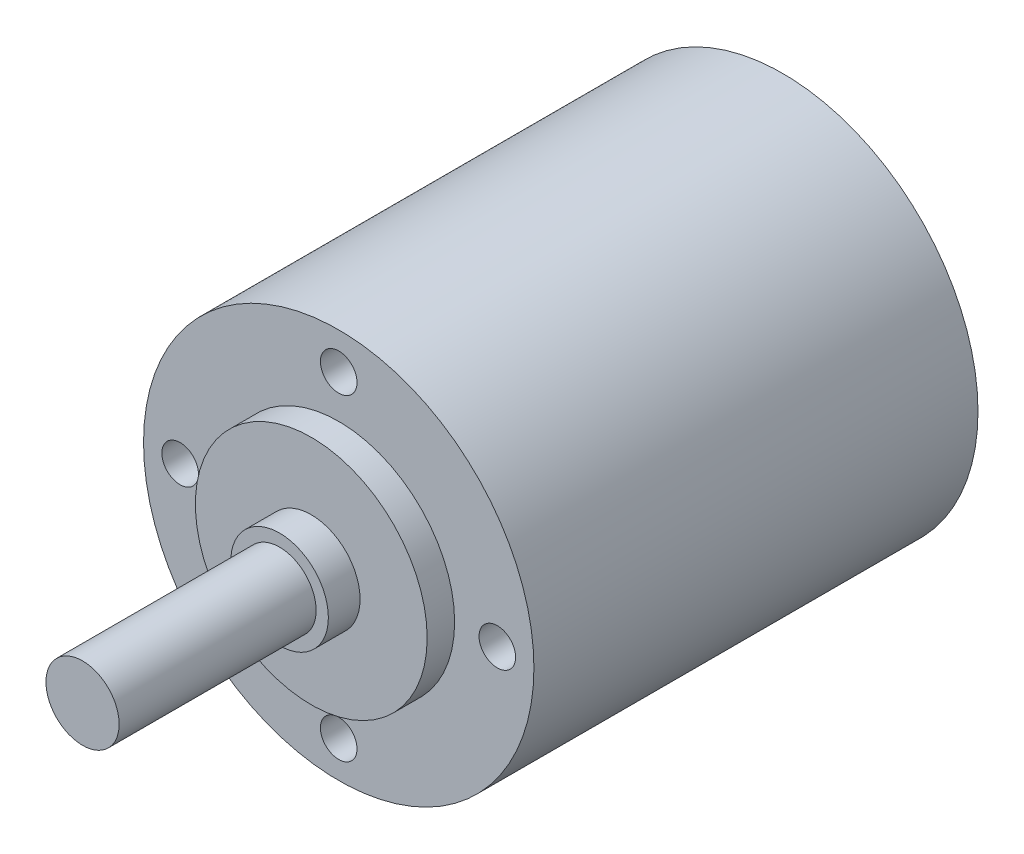
ISO-10303-21;
HEADER;
FILE_DESCRIPTION(('STEP AP214'),'2;1');
FILE_NAME('part.step','',(''),(''),'','','');
FILE_SCHEMA(('AUTOMOTIVE_DESIGN { 1 0 10303 214 1 1 1 1 }'));
ENDSEC;
DATA;
#1=APPLICATION_CONTEXT('core data for automotive mechanical design processes');
#2=APPLICATION_PROTOCOL_DEFINITION('international standard','automotive_design',2000,#1);
#3=PRODUCT_CONTEXT('',#1,'mechanical');
#4=PRODUCT('Part','Part','',(#3));
#5=PRODUCT_RELATED_PRODUCT_CATEGORY('part','',(#4));
#6=PRODUCT_DEFINITION_FORMATION('','',#4);
#7=PRODUCT_DEFINITION_CONTEXT('part definition',#1,'design');
#8=PRODUCT_DEFINITION('design','',#6,#7);
#9=PRODUCT_DEFINITION_SHAPE('','',#8);
#10=(LENGTH_UNIT() NAMED_UNIT(*) SI_UNIT(.MILLI.,.METRE.));
#11=(NAMED_UNIT(*) PLANE_ANGLE_UNIT() SI_UNIT($,.RADIAN.));
#12=(NAMED_UNIT(*) SI_UNIT($,.STERADIAN.) SOLID_ANGLE_UNIT());
#13=UNCERTAINTY_MEASURE_WITH_UNIT(LENGTH_MEASURE(1.E-05),#10,'distance_accuracy_value','');
#14=(GEOMETRIC_REPRESENTATION_CONTEXT(3) GLOBAL_UNCERTAINTY_ASSIGNED_CONTEXT((#13)) GLOBAL_UNIT_ASSIGNED_CONTEXT((#10,
#11,#12)) REPRESENTATION_CONTEXT('',''));
#15=CARTESIAN_POINT('',(0.,0.,0.));
#16=DIRECTION('',(0.,0.,1.));
#17=DIRECTION('',(1.,0.,0.));
#18=AXIS2_PLACEMENT_3D('',#15,#16,#17);
#19=CARTESIAN_POINT('',(0.,0.,41.25));
#20=DIRECTION('',(0.,0.,1.));
#21=DIRECTION('',(1.,0.,0.));
#22=AXIS2_PLACEMENT_3D('',#19,#20,#21);
#23=PLANE('',#22);
#24=CARTESIAN_POINT('',(0.,0.,41.25));
#25=DIRECTION('',(0.,0.,1.));
#26=DIRECTION('',(1.,0.,0.));
#27=AXIS2_PLACEMENT_3D('',#24,#25,#26);
#28=CIRCLE('',#27,4.);
#29=CARTESIAN_POINT('',(4.,0.,41.25));
#30=VERTEX_POINT('',#29);
#31=EDGE_CURVE('E45',#30,#30,#28,.T.);
#32=ORIENTED_EDGE('',*,*,#31,.T.);
#33=EDGE_LOOP('',(#32));
#34=FACE_BOUND('',#33,.T.);
#35=CARTESIAN_POINT('',(0.,0.,41.25));
#36=DIRECTION('',(0.,0.,1.));
#37=DIRECTION('',(1.,0.,0.));
#38=AXIS2_PLACEMENT_3D('',#35,#36,#37);
#39=CIRCLE('',#38,3.);
#40=CARTESIAN_POINT('',(3.,0.,41.25));
#41=VERTEX_POINT('',#40);
#42=EDGE_CURVE('E54',#41,#41,#39,.T.);
#43=ORIENTED_EDGE('',*,*,#42,.F.);
#44=EDGE_LOOP('',(#43));
#45=FACE_BOUND('',#44,.T.);
#46=ADVANCED_FACE('F29',(#34,#45),#23,.T.);
#47=CARTESIAN_POINT('',(0.,0.,38.65));
#48=DIRECTION('',(0.,0.,1.));
#49=DIRECTION('',(1.,0.,0.));
#50=AXIS2_PLACEMENT_3D('',#47,#48,#49);
#51=PLANE('',#50);
#52=CARTESIAN_POINT('',(0.,0.,38.65));
#53=DIRECTION('',(0.,0.,1.));
#54=DIRECTION('',(1.,0.,0.));
#55=AXIS2_PLACEMENT_3D('',#52,#53,#54);
#56=CIRCLE('',#55,9.5);
#57=CARTESIAN_POINT('',(9.5,0.,38.65));
#58=VERTEX_POINT('',#57);
#59=EDGE_CURVE('E40',#58,#58,#56,.T.);
#60=ORIENTED_EDGE('',*,*,#59,.T.);
#61=EDGE_LOOP('',(#60));
#62=FACE_BOUND('',#61,.T.);
#63=CARTESIAN_POINT('',(0.,0.,38.65));
#64=DIRECTION('',(0.,0.,1.));
#65=DIRECTION('',(1.,0.,0.));
#66=AXIS2_PLACEMENT_3D('',#63,#64,#65);
#67=CIRCLE('',#66,4.);
#68=CARTESIAN_POINT('',(4.,0.,38.65));
#69=VERTEX_POINT('',#68);
#70=EDGE_CURVE('E48',#69,#69,#67,.T.);
#71=ORIENTED_EDGE('',*,*,#70,.F.);
#72=EDGE_LOOP('',(#71));
#73=FACE_BOUND('',#72,.T.);
#74=ADVANCED_FACE('F96',(#62,#73),#51,.T.);
#75=CARTESIAN_POINT('',(0.,0.,36.4));
#76=DIRECTION('',(0.,0.,1.));
#77=DIRECTION('',(1.,0.,0.));
#78=AXIS2_PLACEMENT_3D('',#75,#76,#77);
#79=PLANE('',#78);
#80=CARTESIAN_POINT('',(-12.9999999999998,-1.81557029619843E-13,36.4));
#81=DIRECTION('',(0.,0.,1.));
#82=DIRECTION('',(1.,0.,0.));
#83=AXIS2_PLACEMENT_3D('',#80,#81,#82);
#84=CIRCLE('',#83,1.50000000000036);
#85=CARTESIAN_POINT('',(-11.4999999999995,-1.81557029619843E-13,36.4));
#86=VERTEX_POINT('',#85);
#87=EDGE_CURVE('E78',#86,#86,#84,.T.);
#88=ORIENTED_EDGE('',*,*,#87,.F.);
#89=EDGE_LOOP('',(#88));
#90=FACE_BOUND('',#89,.T.);
#91=CARTESIAN_POINT('',(3.66298140917469E-13,-13.,36.4));
#92=DIRECTION('',(0.,0.,1.));
#93=DIRECTION('',(1.,0.,0.));
#94=AXIS2_PLACEMENT_3D('',#91,#92,#93);
#95=CIRCLE('',#94,1.50000000000044);
#96=CARTESIAN_POINT('',(1.5000000000008,-13.,36.4));
#97=VERTEX_POINT('',#96);
#98=EDGE_CURVE('E72',#97,#97,#95,.T.);
#99=ORIENTED_EDGE('',*,*,#98,.F.);
#100=EDGE_LOOP('',(#99));
#101=FACE_BOUND('',#100,.T.);
#102=CARTESIAN_POINT('',(13.,0.,36.4));
#103=DIRECTION('',(0.,0.,1.));
#104=DIRECTION('',(1.,0.,0.));
#105=AXIS2_PLACEMENT_3D('',#102,#103,#104);
#106=CIRCLE('',#105,1.5);
#107=CARTESIAN_POINT('',(14.5,0.,36.4));
#108=VERTEX_POINT('',#107);
#109=EDGE_CURVE('E66',#108,#108,#106,.T.);
#110=ORIENTED_EDGE('',*,*,#109,.F.);
#111=EDGE_LOOP('',(#110));
#112=FACE_BOUND('',#111,.T.);
#113=CARTESIAN_POINT('',(0.,13.,36.4));
#114=DIRECTION('',(0.,0.,1.));
#115=DIRECTION('',(1.,0.,0.));
#116=AXIS2_PLACEMENT_3D('',#113,#114,#115);
#117=CIRCLE('',#116,1.5);
#118=CARTESIAN_POINT('',(1.5,13.,36.4));
#119=VERTEX_POINT('',#118);
#120=EDGE_CURVE('E60',#119,#119,#117,.T.);
#121=ORIENTED_EDGE('',*,*,#120,.F.);
#122=EDGE_LOOP('',(#121));
#123=FACE_BOUND('',#122,.T.);
#124=CARTESIAN_POINT('',(0.,0.,36.4));
#125=DIRECTION('',(0.,0.,1.));
#126=DIRECTION('',(1.,0.,0.));
#127=AXIS2_PLACEMENT_3D('',#124,#125,#126);
#128=CIRCLE('',#127,16.);
#129=CARTESIAN_POINT('',(16.,0.,36.4));
#130=VERTEX_POINT('',#129);
#131=EDGE_CURVE('E10',#130,#130,#128,.T.);
#132=ORIENTED_EDGE('',*,*,#131,.T.);
#133=EDGE_LOOP('',(#132));
#134=FACE_BOUND('',#133,.T.);
#135=CARTESIAN_POINT('',(0.,0.,36.4));
#136=DIRECTION('',(0.,0.,1.));
#137=DIRECTION('',(1.,0.,0.));
#138=AXIS2_PLACEMENT_3D('',#135,#136,#137);
#139=CIRCLE('',#138,9.5);
#140=CARTESIAN_POINT('',(9.5,0.,36.4));
#141=VERTEX_POINT('',#140);
#142=EDGE_CURVE('E42',#141,#141,#139,.T.);
#143=ORIENTED_EDGE('',*,*,#142,.F.);
#144=EDGE_LOOP('',(#143));
#145=FACE_BOUND('',#144,.T.);
#146=ADVANCED_FACE('F93',(#90,#101,#112,#123,#134,#145),#79,.T.);
#147=CARTESIAN_POINT('',(0.,0.,36.4));
#148=DIRECTION('',(0.,0.,-1.));
#149=DIRECTION('',(-1.,0.,0.));
#150=AXIS2_PLACEMENT_3D('',#147,#148,#149);
#151=CYLINDRICAL_SURFACE('',#150,16.);
#152=ORIENTED_EDGE('',*,*,#131,.F.);
#153=EDGE_LOOP('',(#152));
#154=FACE_BOUND('',#153,.T.);
#155=CARTESIAN_POINT('',(0.,0.,0.));
#156=DIRECTION('',(0.,0.,1.));
#157=DIRECTION('',(1.,0.,0.));
#158=AXIS2_PLACEMENT_3D('',#155,#156,#157);
#159=CIRCLE('',#158,16.);
#160=CARTESIAN_POINT('',(16.,0.,0.));
#161=VERTEX_POINT('',#160);
#162=EDGE_CURVE('E33',#161,#161,#159,.T.);
#163=ORIENTED_EDGE('',*,*,#162,.T.);
#164=EDGE_LOOP('',(#163));
#165=FACE_BOUND('',#164,.T.);
#166=ADVANCED_FACE('F31',(#154,#165),#151,.T.);
#167=CARTESIAN_POINT('',(0.,0.,0.));
#168=DIRECTION('',(0.,0.,1.));
#169=DIRECTION('',(1.,0.,0.));
#170=AXIS2_PLACEMENT_3D('',#167,#168,#169);
#171=PLANE('',#170);
#172=ORIENTED_EDGE('',*,*,#162,.F.);
#173=EDGE_LOOP('',(#172));
#174=FACE_BOUND('',#173,.T.);
#175=ADVANCED_FACE('F109',(#174),#171,.F.);
#176=CARTESIAN_POINT('',(0.,0.,38.65));
#177=DIRECTION('',(0.,0.,-1.));
#178=DIRECTION('',(-1.,0.,0.));
#179=AXIS2_PLACEMENT_3D('',#176,#177,#178);
#180=CYLINDRICAL_SURFACE('',#179,9.5);
#181=ORIENTED_EDGE('',*,*,#59,.F.);
#182=EDGE_LOOP('',(#181));
#183=FACE_BOUND('',#182,.T.);
#184=ORIENTED_EDGE('',*,*,#142,.T.);
#185=EDGE_LOOP('',(#184));
#186=FACE_BOUND('',#185,.T.);
#187=ADVANCED_FACE('F106',(#183,#186),#180,.T.);
#188=CARTESIAN_POINT('',(0.,0.,41.25));
#189=DIRECTION('',(0.,0.,-1.));
#190=DIRECTION('',(-1.,0.,0.));
#191=AXIS2_PLACEMENT_3D('',#188,#189,#190);
#192=CYLINDRICAL_SURFACE('',#191,4.);
#193=ORIENTED_EDGE('',*,*,#31,.F.);
#194=EDGE_LOOP('',(#193));
#195=FACE_BOUND('',#194,.T.);
#196=ORIENTED_EDGE('',*,*,#70,.T.);
#197=EDGE_LOOP('',(#196));
#198=FACE_BOUND('',#197,.T.);
#199=ADVANCED_FACE('F108',(#195,#198),#192,.T.);
#200=CARTESIAN_POINT('',(0.,0.,57.4));
#201=DIRECTION('',(0.,0.,-1.));
#202=DIRECTION('',(-1.,0.,0.));
#203=AXIS2_PLACEMENT_3D('',#200,#201,#202);
#204=CYLINDRICAL_SURFACE('',#203,3.);
#205=CARTESIAN_POINT('',(0.,0.,57.4));
#206=DIRECTION('',(0.,0.,1.));
#207=DIRECTION('',(1.,0.,0.));
#208=AXIS2_PLACEMENT_3D('',#205,#206,#207);
#209=CIRCLE('',#208,3.);
#210=CARTESIAN_POINT('',(3.,0.,57.4));
#211=VERTEX_POINT('',#210);
#212=EDGE_CURVE('E51',#211,#211,#209,.T.);
#213=ORIENTED_EDGE('',*,*,#212,.F.);
#214=EDGE_LOOP('',(#213));
#215=FACE_BOUND('',#214,.T.);
#216=ORIENTED_EDGE('',*,*,#42,.T.);
#217=EDGE_LOOP('',(#216));
#218=FACE_BOUND('',#217,.T.);
#219=ADVANCED_FACE('F116',(#215,#218),#204,.T.);
#220=CARTESIAN_POINT('',(0.,0.,57.4));
#221=DIRECTION('',(0.,0.,1.));
#222=DIRECTION('',(1.,0.,0.));
#223=AXIS2_PLACEMENT_3D('',#220,#221,#222);
#224=PLANE('',#223);
#225=ORIENTED_EDGE('',*,*,#212,.T.);
#226=EDGE_LOOP('',(#225));
#227=FACE_BOUND('',#226,.T.);
#228=ADVANCED_FACE('F133',(#227),#224,.T.);
#229=CARTESIAN_POINT('',(0.,13.,32.6));
#230=DIRECTION('',(0.,0.,1.));
#231=DIRECTION('',(1.,0.,0.));
#232=AXIS2_PLACEMENT_3D('',#229,#230,#231);
#233=CYLINDRICAL_SURFACE('',#232,1.5);
#234=CARTESIAN_POINT('',(0.,13.,32.6));
#235=DIRECTION('',(0.,0.,1.));
#236=DIRECTION('',(1.,0.,0.));
#237=AXIS2_PLACEMENT_3D('',#234,#235,#236);
#238=CIRCLE('',#237,1.5);
#239=CARTESIAN_POINT('',(1.5,13.,32.6));
#240=VERTEX_POINT('',#239);
#241=EDGE_CURVE('E57',#240,#240,#238,.T.);
#242=CARTESIAN_POINT('',(1.5,13.,32.6));
#243=CARTESIAN_POINT('',(1.5,13.,32.6395833333333));
#244=CARTESIAN_POINT('',(1.5,13.,32.6791666666667));
#245=CARTESIAN_POINT('',(1.5,13.,32.7583333333333));
#246=CARTESIAN_POINT('',(1.5,13.,32.7979166666667));
#247=CARTESIAN_POINT('',(1.5,13.,32.8770833333333));
#248=CARTESIAN_POINT('',(1.5,13.,32.9166666666667));
#249=CARTESIAN_POINT('',(1.5,13.,32.9958333333333));
#250=CARTESIAN_POINT('',(1.5,13.,33.0354166666667));
#251=CARTESIAN_POINT('',(1.5,13.,33.1145833333333));
#252=CARTESIAN_POINT('',(1.5,13.,33.1541666666667));
#253=CARTESIAN_POINT('',(1.5,13.,33.2333333333333));
#254=CARTESIAN_POINT('',(1.5,13.,33.2729166666667));
#255=CARTESIAN_POINT('',(1.5,13.,33.3520833333333));
#256=CARTESIAN_POINT('',(1.5,13.,33.3916666666667));
#257=CARTESIAN_POINT('',(1.5,13.,33.4708333333333));
#258=CARTESIAN_POINT('',(1.5,13.,33.5104166666667));
#259=CARTESIAN_POINT('',(1.5,13.,33.5895833333333));
#260=CARTESIAN_POINT('',(1.5,13.,33.6291666666667));
#261=CARTESIAN_POINT('',(1.5,13.,33.7083333333333));
#262=CARTESIAN_POINT('',(1.5,13.,33.7479166666667));
#263=CARTESIAN_POINT('',(1.5,13.,33.8270833333333));
#264=CARTESIAN_POINT('',(1.5,13.,33.8666666666667));
#265=CARTESIAN_POINT('',(1.5,13.,33.9458333333333));
#266=CARTESIAN_POINT('',(1.5,13.,33.9854166666667));
#267=CARTESIAN_POINT('',(1.5,13.,34.0645833333333));
#268=CARTESIAN_POINT('',(1.5,13.,34.1041666666667));
#269=CARTESIAN_POINT('',(1.5,13.,34.1833333333333));
#270=CARTESIAN_POINT('',(1.5,13.,34.2229166666667));
#271=CARTESIAN_POINT('',(1.5,13.,34.3020833333333));
#272=CARTESIAN_POINT('',(1.5,13.,34.3416666666667));
#273=CARTESIAN_POINT('',(1.5,13.,34.4208333333333));
#274=CARTESIAN_POINT('',(1.5,13.,34.4604166666667));
#275=CARTESIAN_POINT('',(1.5,13.,34.5395833333333));
#276=CARTESIAN_POINT('',(1.5,13.,34.5791666666667));
#277=CARTESIAN_POINT('',(1.5,13.,34.6583333333333));
#278=CARTESIAN_POINT('',(1.5,13.,34.6979166666667));
#279=CARTESIAN_POINT('',(1.5,13.,34.7770833333333));
#280=CARTESIAN_POINT('',(1.5,13.,34.8166666666667));
#281=CARTESIAN_POINT('',(1.5,13.,34.8958333333333));
#282=CARTESIAN_POINT('',(1.5,13.,34.9354166666667));
#283=CARTESIAN_POINT('',(1.5,13.,35.0145833333333));
#284=CARTESIAN_POINT('',(1.5,13.,35.0541666666667));
#285=CARTESIAN_POINT('',(1.5,13.,35.1333333333333));
#286=CARTESIAN_POINT('',(1.5,13.,35.1729166666667));
#287=CARTESIAN_POINT('',(1.5,13.,35.2520833333333));
#288=CARTESIAN_POINT('',(1.5,13.,35.2916666666667));
#289=CARTESIAN_POINT('',(1.5,13.,35.3708333333333));
#290=CARTESIAN_POINT('',(1.5,13.,35.4104166666667));
#291=CARTESIAN_POINT('',(1.5,13.,35.4895833333333));
#292=CARTESIAN_POINT('',(1.5,13.,35.5291666666667));
#293=CARTESIAN_POINT('',(1.5,13.,35.6083333333333));
#294=CARTESIAN_POINT('',(1.5,13.,35.6479166666667));
#295=CARTESIAN_POINT('',(1.5,13.,35.7270833333333));
#296=CARTESIAN_POINT('',(1.5,13.,35.7666666666667));
#297=CARTESIAN_POINT('',(1.5,13.,35.8458333333333));
#298=CARTESIAN_POINT('',(1.5,13.,35.8854166666667));
#299=CARTESIAN_POINT('',(1.5,13.,35.9645833333333));
#300=CARTESIAN_POINT('',(1.5,13.,36.0041666666667));
#301=CARTESIAN_POINT('',(1.5,13.,36.0833333333333));
#302=CARTESIAN_POINT('',(1.5,13.,36.1229166666667));
#303=CARTESIAN_POINT('',(1.5,13.,36.2020833333333));
#304=CARTESIAN_POINT('',(1.5,13.,36.2416666666667));
#305=CARTESIAN_POINT('',(1.5,13.,36.3208333333333));
#306=CARTESIAN_POINT('',(1.5,13.,36.3604166666667));
#307=CARTESIAN_POINT('',(1.5,13.,36.4));
#308=B_SPLINE_CURVE_WITH_KNOTS('',3,(#242,#243,#244,#245,#246,#247,#248,#249,#250,#251,#252,
#253,#254,#255,#256,#257,#258,#259,#260,#261,#262,#263,#264,#265,#266,#267,#268,#269,#270,#271,
#272,#273,#274,#275,#276,#277,#278,#279,#280,#281,#282,#283,#284,#285,#286,#287,#288,#289,#290,
#291,#292,#293,#294,#295,#296,#297,#298,#299,#300,#301,#302,#303,#304,#305,#306,#307),
.UNSPECIFIED.,.F.,.F.,(4,2,2,2,2,2,2,2,2,2,2,2,2,2,2,2,2,2,2,2,2,2,2,2,2,2,2,2,2,2,2,2,4),(0.,
0.118750000000001,0.237500000000002,0.356250000000002,0.475000000000003,0.593750000000004,
0.712500000000005,0.831250000000006,0.95,1.06875,1.1875,1.30625,1.425,1.54375,1.6625,
1.78125000000001,1.9,2.01875,2.1375,2.25625,2.375,2.49375,2.6125,2.73125,2.85,2.96875,3.0875,
3.20625,3.325,3.44375,3.5625,3.68125,3.8),.UNSPECIFIED.);
#309=EDGE_CURVE('BSEAM137',#240,#119,#308,.T.);
#310=ORIENTED_EDGE('',*,*,#241,.F.);
#311=ORIENTED_EDGE('',*,*,#120,.T.);
#312=ORIENTED_EDGE('',*,*,#309,.T.);
#313=ORIENTED_EDGE('',*,*,#309,.F.);
#314=EDGE_LOOP('',(#310,#312,#311,#313));
#315=FACE_BOUND('',#314,.T.);
#316=ADVANCED_FACE('F137',(#315),#233,.F.);
#317=CARTESIAN_POINT('',(0.,13.,32.6));
#318=DIRECTION('',(0.,0.,1.));
#319=DIRECTION('',(1.,0.,0.));
#320=AXIS2_PLACEMENT_3D('',#317,#318,#319);
#321=PLANE('',#320);
#322=ORIENTED_EDGE('',*,*,#241,.T.);
#323=EDGE_LOOP('',(#322));
#324=FACE_BOUND('',#323,.T.);
#325=ADVANCED_FACE('F141',(#324),#321,.T.);
#326=CARTESIAN_POINT('',(13.,0.,32.6));
#327=DIRECTION('',(0.,0.,1.));
#328=DIRECTION('',(1.,0.,0.));
#329=AXIS2_PLACEMENT_3D('',#326,#327,#328);
#330=CYLINDRICAL_SURFACE('',#329,1.5);
#331=CARTESIAN_POINT('',(13.,0.,32.6));
#332=DIRECTION('',(0.,0.,1.));
#333=DIRECTION('',(1.,0.,0.));
#334=AXIS2_PLACEMENT_3D('',#331,#332,#333);
#335=CIRCLE('',#334,1.5);
#336=CARTESIAN_POINT('',(14.5,0.,32.6));
#337=VERTEX_POINT('',#336);
#338=EDGE_CURVE('E63',#337,#337,#335,.T.);
#339=CARTESIAN_POINT('',(14.5,0.,32.6));
#340=CARTESIAN_POINT('',(14.5,0.,32.6395833333333));
#341=CARTESIAN_POINT('',(14.5,0.,32.6791666666667));
#342=CARTESIAN_POINT('',(14.5,0.,32.7583333333333));
#343=CARTESIAN_POINT('',(14.5,0.,32.7979166666667));
#344=CARTESIAN_POINT('',(14.5,0.,32.8770833333333));
#345=CARTESIAN_POINT('',(14.5,0.,32.9166666666667));
#346=CARTESIAN_POINT('',(14.5,0.,32.9958333333333));
#347=CARTESIAN_POINT('',(14.5,0.,33.0354166666667));
#348=CARTESIAN_POINT('',(14.5,0.,33.1145833333333));
#349=CARTESIAN_POINT('',(14.5,0.,33.1541666666667));
#350=CARTESIAN_POINT('',(14.5,0.,33.2333333333333));
#351=CARTESIAN_POINT('',(14.5,0.,33.2729166666667));
#352=CARTESIAN_POINT('',(14.5,0.,33.3520833333333));
#353=CARTESIAN_POINT('',(14.5,0.,33.3916666666667));
#354=CARTESIAN_POINT('',(14.5,0.,33.4708333333333));
#355=CARTESIAN_POINT('',(14.5,0.,33.5104166666667));
#356=CARTESIAN_POINT('',(14.5,0.,33.5895833333333));
#357=CARTESIAN_POINT('',(14.5,0.,33.6291666666667));
#358=CARTESIAN_POINT('',(14.5,0.,33.7083333333333));
#359=CARTESIAN_POINT('',(14.5,0.,33.7479166666667));
#360=CARTESIAN_POINT('',(14.5,0.,33.8270833333333));
#361=CARTESIAN_POINT('',(14.5,0.,33.8666666666667));
#362=CARTESIAN_POINT('',(14.5,0.,33.9458333333333));
#363=CARTESIAN_POINT('',(14.5,0.,33.9854166666667));
#364=CARTESIAN_POINT('',(14.5,0.,34.0645833333333));
#365=CARTESIAN_POINT('',(14.5,0.,34.1041666666667));
#366=CARTESIAN_POINT('',(14.5,0.,34.1833333333333));
#367=CARTESIAN_POINT('',(14.5,0.,34.2229166666667));
#368=CARTESIAN_POINT('',(14.5,0.,34.3020833333333));
#369=CARTESIAN_POINT('',(14.5,0.,34.3416666666667));
#370=CARTESIAN_POINT('',(14.5,0.,34.4208333333333));
#371=CARTESIAN_POINT('',(14.5,0.,34.4604166666667));
#372=CARTESIAN_POINT('',(14.5,0.,34.5395833333333));
#373=CARTESIAN_POINT('',(14.5,0.,34.5791666666667));
#374=CARTESIAN_POINT('',(14.5,0.,34.6583333333333));
#375=CARTESIAN_POINT('',(14.5,0.,34.6979166666667));
#376=CARTESIAN_POINT('',(14.5,0.,34.7770833333333));
#377=CARTESIAN_POINT('',(14.5,0.,34.8166666666667));
#378=CARTESIAN_POINT('',(14.5,0.,34.8958333333333));
#379=CARTESIAN_POINT('',(14.5,0.,34.9354166666667));
#380=CARTESIAN_POINT('',(14.5,0.,35.0145833333333));
#381=CARTESIAN_POINT('',(14.5,0.,35.0541666666667));
#382=CARTESIAN_POINT('',(14.5,0.,35.1333333333333));
#383=CARTESIAN_POINT('',(14.5,0.,35.1729166666667));
#384=CARTESIAN_POINT('',(14.5,0.,35.2520833333333));
#385=CARTESIAN_POINT('',(14.5,0.,35.2916666666667));
#386=CARTESIAN_POINT('',(14.5,0.,35.3708333333333));
#387=CARTESIAN_POINT('',(14.5,0.,35.4104166666667));
#388=CARTESIAN_POINT('',(14.5,0.,35.4895833333333));
#389=CARTESIAN_POINT('',(14.5,0.,35.5291666666667));
#390=CARTESIAN_POINT('',(14.5,0.,35.6083333333333));
#391=CARTESIAN_POINT('',(14.5,0.,35.6479166666667));
#392=CARTESIAN_POINT('',(14.5,0.,35.7270833333333));
#393=CARTESIAN_POINT('',(14.5,0.,35.7666666666667));
#394=CARTESIAN_POINT('',(14.5,0.,35.8458333333333));
#395=CARTESIAN_POINT('',(14.5,0.,35.8854166666667));
#396=CARTESIAN_POINT('',(14.5,0.,35.9645833333333));
#397=CARTESIAN_POINT('',(14.5,0.,36.0041666666667));
#398=CARTESIAN_POINT('',(14.5,0.,36.0833333333333));
#399=CARTESIAN_POINT('',(14.5,0.,36.1229166666667));
#400=CARTESIAN_POINT('',(14.5,0.,36.2020833333333));
#401=CARTESIAN_POINT('',(14.5,0.,36.2416666666667));
#402=CARTESIAN_POINT('',(14.5,0.,36.3208333333333));
#403=CARTESIAN_POINT('',(14.5,0.,36.3604166666667));
#404=CARTESIAN_POINT('',(14.5,0.,36.4));
#405=B_SPLINE_CURVE_WITH_KNOTS('',3,(#339,#340,#341,#342,#343,#344,#345,#346,#347,#348,#349,
#350,#351,#352,#353,#354,#355,#356,#357,#358,#359,#360,#361,#362,#363,#364,#365,#366,#367,#368,
#369,#370,#371,#372,#373,#374,#375,#376,#377,#378,#379,#380,#381,#382,#383,#384,#385,#386,#387,
#388,#389,#390,#391,#392,#393,#394,#395,#396,#397,#398,#399,#400,#401,#402,#403,#404),
.UNSPECIFIED.,.F.,.F.,(4,2,2,2,2,2,2,2,2,2,2,2,2,2,2,2,2,2,2,2,2,2,2,2,2,2,2,2,2,2,2,2,4),(0.,
0.118750000000001,0.237500000000002,0.356250000000002,0.475000000000003,0.593750000000004,
0.712500000000005,0.831250000000006,0.95,1.06875,1.1875,1.30625,1.425,1.54375,1.6625,
1.78125000000001,1.9,2.01875,2.1375,2.25625,2.375,2.49375,2.6125,2.73125,2.85,2.96875,3.0875,
3.20625,3.325,3.44375,3.5625,3.68125,3.8),.UNSPECIFIED.);
#406=EDGE_CURVE('BSEAM145',#337,#108,#405,.T.);
#407=ORIENTED_EDGE('',*,*,#338,.F.);
#408=ORIENTED_EDGE('',*,*,#109,.T.);
#409=ORIENTED_EDGE('',*,*,#406,.T.);
#410=ORIENTED_EDGE('',*,*,#406,.F.);
#411=EDGE_LOOP('',(#407,#409,#408,#410));
#412=FACE_BOUND('',#411,.T.);
#413=ADVANCED_FACE('F145',(#412),#330,.F.);
#414=CARTESIAN_POINT('',(13.,0.,32.6));
#415=DIRECTION('',(0.,0.,1.));
#416=DIRECTION('',(1.,0.,0.));
#417=AXIS2_PLACEMENT_3D('',#414,#415,#416);
#418=PLANE('',#417);
#419=ORIENTED_EDGE('',*,*,#338,.T.);
#420=EDGE_LOOP('',(#419));
#421=FACE_BOUND('',#420,.T.);
#422=ADVANCED_FACE('F149',(#421),#418,.T.);
#423=CARTESIAN_POINT('',(3.66298140917469E-13,-13.,32.6));
#424=DIRECTION('',(0.,0.,1.));
#425=DIRECTION('',(1.,0.,0.));
#426=AXIS2_PLACEMENT_3D('',#423,#424,#425);
#427=CYLINDRICAL_SURFACE('',#426,1.50000000000044);
#428=CARTESIAN_POINT('',(3.66298140917469E-13,-13.,32.6));
#429=DIRECTION('',(0.,0.,1.));
#430=DIRECTION('',(1.,0.,0.));
#431=AXIS2_PLACEMENT_3D('',#428,#429,#430);
#432=CIRCLE('',#431,1.50000000000044);
#433=CARTESIAN_POINT('',(1.5000000000008,-13.,32.6));
#434=VERTEX_POINT('',#433);
#435=EDGE_CURVE('E69',#434,#434,#432,.T.);
#436=CARTESIAN_POINT('',(1.5000000000008,-13.,32.6));
#437=CARTESIAN_POINT('',(1.5000000000008,-13.,32.6395833333333));
#438=CARTESIAN_POINT('',(1.5000000000008,-13.,32.6791666666667));
#439=CARTESIAN_POINT('',(1.5000000000008,-13.,32.7583333333333));
#440=CARTESIAN_POINT('',(1.5000000000008,-13.,32.7979166666667));
#441=CARTESIAN_POINT('',(1.5000000000008,-13.,32.8770833333333));
#442=CARTESIAN_POINT('',(1.5000000000008,-13.,32.9166666666667));
#443=CARTESIAN_POINT('',(1.5000000000008,-13.,32.9958333333333));
#444=CARTESIAN_POINT('',(1.5000000000008,-13.,33.0354166666667));
#445=CARTESIAN_POINT('',(1.5000000000008,-13.,33.1145833333333));
#446=CARTESIAN_POINT('',(1.5000000000008,-13.,33.1541666666667));
#447=CARTESIAN_POINT('',(1.5000000000008,-13.,33.2333333333333));
#448=CARTESIAN_POINT('',(1.5000000000008,-13.,33.2729166666667));
#449=CARTESIAN_POINT('',(1.5000000000008,-13.,33.3520833333333));
#450=CARTESIAN_POINT('',(1.5000000000008,-13.,33.3916666666667));
#451=CARTESIAN_POINT('',(1.5000000000008,-13.,33.4708333333333));
#452=CARTESIAN_POINT('',(1.5000000000008,-13.,33.5104166666667));
#453=CARTESIAN_POINT('',(1.5000000000008,-13.,33.5895833333333));
#454=CARTESIAN_POINT('',(1.5000000000008,-13.,33.6291666666667));
#455=CARTESIAN_POINT('',(1.5000000000008,-13.,33.7083333333333));
#456=CARTESIAN_POINT('',(1.5000000000008,-13.,33.7479166666667));
#457=CARTESIAN_POINT('',(1.5000000000008,-13.,33.8270833333333));
#458=CARTESIAN_POINT('',(1.5000000000008,-13.,33.8666666666667));
#459=CARTESIAN_POINT('',(1.5000000000008,-13.,33.9458333333333));
#460=CARTESIAN_POINT('',(1.5000000000008,-13.,33.9854166666667));
#461=CARTESIAN_POINT('',(1.5000000000008,-13.,34.0645833333333));
#462=CARTESIAN_POINT('',(1.5000000000008,-13.,34.1041666666667));
#463=CARTESIAN_POINT('',(1.5000000000008,-13.,34.1833333333333));
#464=CARTESIAN_POINT('',(1.5000000000008,-13.,34.2229166666667));
#465=CARTESIAN_POINT('',(1.5000000000008,-13.,34.3020833333333));
#466=CARTESIAN_POINT('',(1.5000000000008,-13.,34.3416666666667));
#467=CARTESIAN_POINT('',(1.5000000000008,-13.,34.4208333333333));
#468=CARTESIAN_POINT('',(1.5000000000008,-13.,34.4604166666667));
#469=CARTESIAN_POINT('',(1.5000000000008,-13.,34.5395833333333));
#470=CARTESIAN_POINT('',(1.5000000000008,-13.,34.5791666666667));
#471=CARTESIAN_POINT('',(1.5000000000008,-13.,34.6583333333333));
#472=CARTESIAN_POINT('',(1.5000000000008,-13.,34.6979166666667));
#473=CARTESIAN_POINT('',(1.5000000000008,-13.,34.7770833333333));
#474=CARTESIAN_POINT('',(1.5000000000008,-13.,34.8166666666667));
#475=CARTESIAN_POINT('',(1.5000000000008,-13.,34.8958333333333));
#476=CARTESIAN_POINT('',(1.5000000000008,-13.,34.9354166666667));
#477=CARTESIAN_POINT('',(1.5000000000008,-13.,35.0145833333333));
#478=CARTESIAN_POINT('',(1.5000000000008,-13.,35.0541666666667));
#479=CARTESIAN_POINT('',(1.5000000000008,-13.,35.1333333333333));
#480=CARTESIAN_POINT('',(1.5000000000008,-13.,35.1729166666667));
#481=CARTESIAN_POINT('',(1.5000000000008,-13.,35.2520833333333));
#482=CARTESIAN_POINT('',(1.5000000000008,-13.,35.2916666666667));
#483=CARTESIAN_POINT('',(1.5000000000008,-13.,35.3708333333333));
#484=CARTESIAN_POINT('',(1.5000000000008,-13.,35.4104166666667));
#485=CARTESIAN_POINT('',(1.5000000000008,-13.,35.4895833333333));
#486=CARTESIAN_POINT('',(1.5000000000008,-13.,35.5291666666667));
#487=CARTESIAN_POINT('',(1.5000000000008,-13.,35.6083333333333));
#488=CARTESIAN_POINT('',(1.5000000000008,-13.,35.6479166666667));
#489=CARTESIAN_POINT('',(1.5000000000008,-13.,35.7270833333333));
#490=CARTESIAN_POINT('',(1.5000000000008,-13.,35.7666666666667));
#491=CARTESIAN_POINT('',(1.5000000000008,-13.,35.8458333333333));
#492=CARTESIAN_POINT('',(1.5000000000008,-13.,35.8854166666667));
#493=CARTESIAN_POINT('',(1.5000000000008,-13.,35.9645833333333));
#494=CARTESIAN_POINT('',(1.5000000000008,-13.,36.0041666666667));
#495=CARTESIAN_POINT('',(1.5000000000008,-13.,36.0833333333333));
#496=CARTESIAN_POINT('',(1.5000000000008,-13.,36.1229166666667));
#497=CARTESIAN_POINT('',(1.5000000000008,-13.,36.2020833333333));
#498=CARTESIAN_POINT('',(1.5000000000008,-13.,36.2416666666667));
#499=CARTESIAN_POINT('',(1.5000000000008,-13.,36.3208333333333));
#500=CARTESIAN_POINT('',(1.5000000000008,-13.,36.3604166666667));
#501=CARTESIAN_POINT('',(1.5000000000008,-13.,36.4));
#502=B_SPLINE_CURVE_WITH_KNOTS('',3,(#436,#437,#438,#439,#440,#441,#442,#443,#444,#445,#446,
#447,#448,#449,#450,#451,#452,#453,#454,#455,#456,#457,#458,#459,#460,#461,#462,#463,#464,#465,
#466,#467,#468,#469,#470,#471,#472,#473,#474,#475,#476,#477,#478,#479,#480,#481,#482,#483,#484,
#485,#486,#487,#488,#489,#490,#491,#492,#493,#494,#495,#496,#497,#498,#499,#500,#501),
.UNSPECIFIED.,.F.,.F.,(4,2,2,2,2,2,2,2,2,2,2,2,2,2,2,2,2,2,2,2,2,2,2,2,2,2,2,2,2,2,2,2,4),(0.,
0.118750000000001,0.237500000000002,0.356250000000002,0.475000000000003,0.593750000000004,
0.712500000000005,0.831250000000006,0.95,1.06875,1.1875,1.30625,1.425,1.54375,1.6625,
1.78125000000001,1.9,2.01875,2.1375,2.25625,2.375,2.49375,2.6125,2.73125,2.85,2.96875,3.0875,
3.20625,3.325,3.44375,3.5625,3.68125,3.8),.UNSPECIFIED.);
#503=EDGE_CURVE('BSEAM153',#434,#97,#502,.T.);
#504=ORIENTED_EDGE('',*,*,#435,.F.);
#505=ORIENTED_EDGE('',*,*,#98,.T.);
#506=ORIENTED_EDGE('',*,*,#503,.T.);
#507=ORIENTED_EDGE('',*,*,#503,.F.);
#508=EDGE_LOOP('',(#504,#506,#505,#507));
#509=FACE_BOUND('',#508,.T.);
#510=ADVANCED_FACE('F153',(#509),#427,.F.);
#511=CARTESIAN_POINT('',(3.66298140917469E-13,-13.,32.6));
#512=DIRECTION('',(0.,0.,1.));
#513=DIRECTION('',(1.,0.,0.));
#514=AXIS2_PLACEMENT_3D('',#511,#512,#513);
#515=PLANE('',#514);
#516=ORIENTED_EDGE('',*,*,#435,.T.);
#517=EDGE_LOOP('',(#516));
#518=FACE_BOUND('',#517,.T.);
#519=ADVANCED_FACE('F89',(#518),#515,.T.);
#520=CARTESIAN_POINT('',(-12.9999999999998,-1.81557029619843E-13,32.6));
#521=DIRECTION('',(0.,0.,1.));
#522=DIRECTION('',(1.,0.,0.));
#523=AXIS2_PLACEMENT_3D('',#520,#521,#522);
#524=CYLINDRICAL_SURFACE('',#523,1.50000000000036);
#525=CARTESIAN_POINT('',(-12.9999999999998,-1.81557029619843E-13,32.6));
#526=DIRECTION('',(0.,0.,1.));
#527=DIRECTION('',(1.,0.,0.));
#528=AXIS2_PLACEMENT_3D('',#525,#526,#527);
#529=CIRCLE('',#528,1.50000000000036);
#530=CARTESIAN_POINT('',(-11.4999999999995,-1.81557029619843E-13,32.6));
#531=VERTEX_POINT('',#530);
#532=EDGE_CURVE('E75',#531,#531,#529,.T.);
#533=CARTESIAN_POINT('',(-11.4999999999995,-1.81557029619843E-13,32.6));
#534=CARTESIAN_POINT('',(-11.4999999999995,-1.81557029619843E-13,32.6395833333333));
#535=CARTESIAN_POINT('',(-11.4999999999995,-1.81557029619843E-13,32.6791666666667));
#536=CARTESIAN_POINT('',(-11.4999999999995,-1.81557029619843E-13,32.7583333333333));
#537=CARTESIAN_POINT('',(-11.4999999999995,-1.81557029619843E-13,32.7979166666667));
#538=CARTESIAN_POINT('',(-11.4999999999995,-1.81557029619843E-13,32.8770833333333));
#539=CARTESIAN_POINT('',(-11.4999999999995,-1.81557029619843E-13,32.9166666666667));
#540=CARTESIAN_POINT('',(-11.4999999999995,-1.81557029619843E-13,32.9958333333333));
#541=CARTESIAN_POINT('',(-11.4999999999995,-1.81557029619843E-13,33.0354166666667));
#542=CARTESIAN_POINT('',(-11.4999999999995,-1.81557029619843E-13,33.1145833333333));
#543=CARTESIAN_POINT('',(-11.4999999999995,-1.81557029619843E-13,33.1541666666667));
#544=CARTESIAN_POINT('',(-11.4999999999995,-1.81557029619843E-13,33.2333333333333));
#545=CARTESIAN_POINT('',(-11.4999999999995,-1.81557029619843E-13,33.2729166666667));
#546=CARTESIAN_POINT('',(-11.4999999999995,-1.81557029619843E-13,33.3520833333333));
#547=CARTESIAN_POINT('',(-11.4999999999995,-1.81557029619843E-13,33.3916666666667));
#548=CARTESIAN_POINT('',(-11.4999999999995,-1.81557029619843E-13,33.4708333333333));
#549=CARTESIAN_POINT('',(-11.4999999999995,-1.81557029619843E-13,33.5104166666667));
#550=CARTESIAN_POINT('',(-11.4999999999995,-1.81557029619843E-13,33.5895833333333));
#551=CARTESIAN_POINT('',(-11.4999999999995,-1.81557029619843E-13,33.6291666666667));
#552=CARTESIAN_POINT('',(-11.4999999999995,-1.81557029619843E-13,33.7083333333333));
#553=CARTESIAN_POINT('',(-11.4999999999995,-1.81557029619843E-13,33.7479166666667));
#554=CARTESIAN_POINT('',(-11.4999999999995,-1.81557029619843E-13,33.8270833333333));
#555=CARTESIAN_POINT('',(-11.4999999999995,-1.81557029619843E-13,33.8666666666667));
#556=CARTESIAN_POINT('',(-11.4999999999995,-1.81557029619843E-13,33.9458333333333));
#557=CARTESIAN_POINT('',(-11.4999999999995,-1.81557029619843E-13,33.9854166666667));
#558=CARTESIAN_POINT('',(-11.4999999999995,-1.81557029619843E-13,34.0645833333333));
#559=CARTESIAN_POINT('',(-11.4999999999995,-1.81557029619843E-13,34.1041666666667));
#560=CARTESIAN_POINT('',(-11.4999999999995,-1.81557029619843E-13,34.1833333333333));
#561=CARTESIAN_POINT('',(-11.4999999999995,-1.81557029619843E-13,34.2229166666667));
#562=CARTESIAN_POINT('',(-11.4999999999995,-1.81557029619843E-13,34.3020833333333));
#563=CARTESIAN_POINT('',(-11.4999999999995,-1.81557029619843E-13,34.3416666666667));
#564=CARTESIAN_POINT('',(-11.4999999999995,-1.81557029619843E-13,34.4208333333333));
#565=CARTESIAN_POINT('',(-11.4999999999995,-1.81557029619843E-13,34.4604166666667));
#566=CARTESIAN_POINT('',(-11.4999999999995,-1.81557029619843E-13,34.5395833333333));
#567=CARTESIAN_POINT('',(-11.4999999999995,-1.81557029619843E-13,34.5791666666667));
#568=CARTESIAN_POINT('',(-11.4999999999995,-1.81557029619843E-13,34.6583333333333));
#569=CARTESIAN_POINT('',(-11.4999999999995,-1.81557029619843E-13,34.6979166666667));
#570=CARTESIAN_POINT('',(-11.4999999999995,-1.81557029619843E-13,34.7770833333333));
#571=CARTESIAN_POINT('',(-11.4999999999995,-1.81557029619843E-13,34.8166666666667));
#572=CARTESIAN_POINT('',(-11.4999999999995,-1.81557029619843E-13,34.8958333333333));
#573=CARTESIAN_POINT('',(-11.4999999999995,-1.81557029619843E-13,34.9354166666667));
#574=CARTESIAN_POINT('',(-11.4999999999995,-1.81557029619843E-13,35.0145833333333));
#575=CARTESIAN_POINT('',(-11.4999999999995,-1.81557029619843E-13,35.0541666666667));
#576=CARTESIAN_POINT('',(-11.4999999999995,-1.81557029619843E-13,35.1333333333333));
#577=CARTESIAN_POINT('',(-11.4999999999995,-1.81557029619843E-13,35.1729166666667));
#578=CARTESIAN_POINT('',(-11.4999999999995,-1.81557029619843E-13,35.2520833333333));
#579=CARTESIAN_POINT('',(-11.4999999999995,-1.81557029619843E-13,35.2916666666667));
#580=CARTESIAN_POINT('',(-11.4999999999995,-1.81557029619843E-13,35.3708333333333));
#581=CARTESIAN_POINT('',(-11.4999999999995,-1.81557029619843E-13,35.4104166666667));
#582=CARTESIAN_POINT('',(-11.4999999999995,-1.81557029619843E-13,35.4895833333333));
#583=CARTESIAN_POINT('',(-11.4999999999995,-1.81557029619843E-13,35.5291666666667));
#584=CARTESIAN_POINT('',(-11.4999999999995,-1.81557029619843E-13,35.6083333333333));
#585=CARTESIAN_POINT('',(-11.4999999999995,-1.81557029619843E-13,35.6479166666667));
#586=CARTESIAN_POINT('',(-11.4999999999995,-1.81557029619843E-13,35.7270833333333));
#587=CARTESIAN_POINT('',(-11.4999999999995,-1.81557029619843E-13,35.7666666666667));
#588=CARTESIAN_POINT('',(-11.4999999999995,-1.81557029619843E-13,35.8458333333333));
#589=CARTESIAN_POINT('',(-11.4999999999995,-1.81557029619843E-13,35.8854166666667));
#590=CARTESIAN_POINT('',(-11.4999999999995,-1.81557029619843E-13,35.9645833333333));
#591=CARTESIAN_POINT('',(-11.4999999999995,-1.81557029619843E-13,36.0041666666667));
#592=CARTESIAN_POINT('',(-11.4999999999995,-1.81557029619843E-13,36.0833333333333));
#593=CARTESIAN_POINT('',(-11.4999999999995,-1.81557029619843E-13,36.1229166666667));
#594=CARTESIAN_POINT('',(-11.4999999999995,-1.81557029619843E-13,36.2020833333333));
#595=CARTESIAN_POINT('',(-11.4999999999995,-1.81557029619843E-13,36.2416666666667));
#596=CARTESIAN_POINT('',(-11.4999999999995,-1.81557029619843E-13,36.3208333333333));
#597=CARTESIAN_POINT('',(-11.4999999999995,-1.81557029619843E-13,36.3604166666667));
#598=CARTESIAN_POINT('',(-11.4999999999995,-1.81557029619843E-13,36.4));
#599=B_SPLINE_CURVE_WITH_KNOTS('',3,(#533,#534,#535,#536,#537,#538,#539,#540,#541,#542,#543,
#544,#545,#546,#547,#548,#549,#550,#551,#552,#553,#554,#555,#556,#557,#558,#559,#560,#561,#562,
#563,#564,#565,#566,#567,#568,#569,#570,#571,#572,#573,#574,#575,#576,#577,#578,#579,#580,#581,
#582,#583,#584,#585,#586,#587,#588,#589,#590,#591,#592,#593,#594,#595,#596,#597,#598),
.UNSPECIFIED.,.F.,.F.,(4,2,2,2,2,2,2,2,2,2,2,2,2,2,2,2,2,2,2,2,2,2,2,2,2,2,2,2,2,2,2,2,4),(0.,
0.118750000000001,0.237500000000002,0.356250000000002,0.475000000000003,0.593750000000004,
0.712500000000005,0.831250000000006,0.95,1.06875,1.1875,1.30625,1.425,1.54375,1.6625,
1.78125000000001,1.9,2.01875,2.1375,2.25625,2.375,2.49375,2.6125,2.73125,2.85,2.96875,3.0875,
3.20625,3.325,3.44375,3.5625,3.68125,3.8),.UNSPECIFIED.);
#600=EDGE_CURVE('BSEAM86',#531,#86,#599,.T.);
#601=ORIENTED_EDGE('',*,*,#532,.F.);
#602=ORIENTED_EDGE('',*,*,#87,.T.);
#603=ORIENTED_EDGE('',*,*,#600,.T.);
#604=ORIENTED_EDGE('',*,*,#600,.F.);
#605=EDGE_LOOP('',(#601,#603,#602,#604));
#606=FACE_BOUND('',#605,.T.);
#607=ADVANCED_FACE('F86',(#606),#524,.F.);
#608=CARTESIAN_POINT('',(-12.9999999999998,-1.81557029619843E-13,32.6));
#609=DIRECTION('',(0.,0.,1.));
#610=DIRECTION('',(1.,0.,0.));
#611=AXIS2_PLACEMENT_3D('',#608,#609,#610);
#612=PLANE('',#611);
#613=ORIENTED_EDGE('',*,*,#532,.T.);
#614=EDGE_LOOP('',(#613));
#615=FACE_BOUND('',#614,.T.);
#616=ADVANCED_FACE('F84',(#615),#612,.T.);
#617=CLOSED_SHELL('',(#46,#74,#146,#166,#175,#187,#199,#219,#228,#316,#325,#413,#422,#510,#519,
#607,#616));
#618=MANIFOLD_SOLID_BREP('B2',#617);
#619=ADVANCED_BREP_SHAPE_REPRESENTATION('',(#18,#618),#14);
#620=SHAPE_DEFINITION_REPRESENTATION(#9,#619);
ENDSEC;
END-ISO-10303-21;
